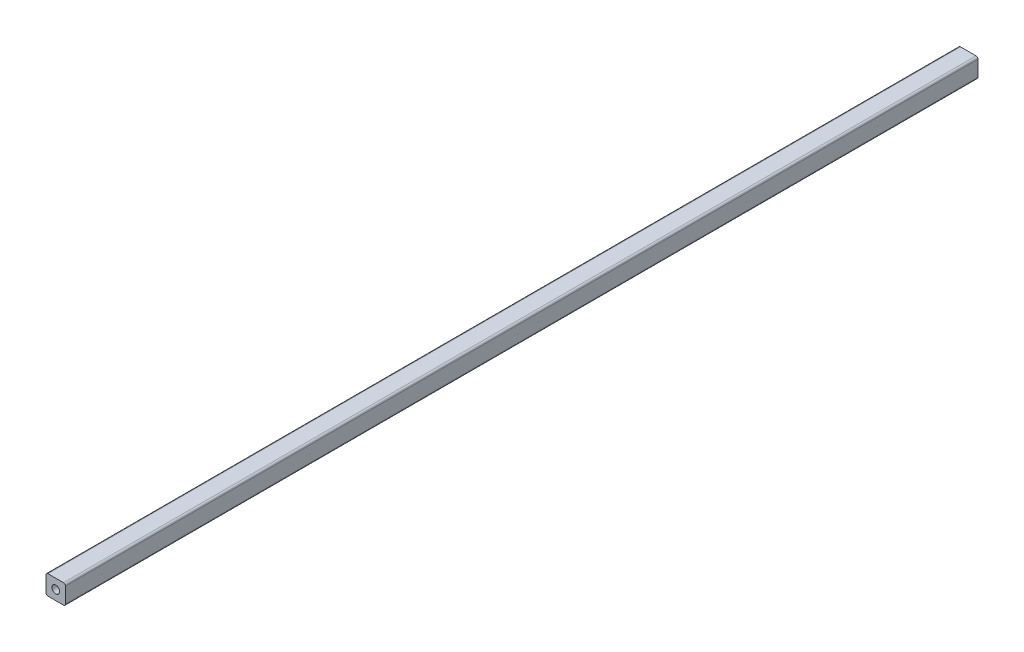
ISO-10303-21;
HEADER;
FILE_DESCRIPTION(('STEP AP214'),'2;1');
FILE_NAME('part.step','',(''),(''),'','','');
FILE_SCHEMA(('AUTOMOTIVE_DESIGN { 1 0 10303 214 1 1 1 1 }'));
ENDSEC;
DATA;
#1=APPLICATION_CONTEXT('core data for automotive mechanical design processes');
#2=APPLICATION_PROTOCOL_DEFINITION('international standard','automotive_design',2000,#1);
#3=PRODUCT_CONTEXT('',#1,'mechanical');
#4=PRODUCT('Part','Part','',(#3));
#5=PRODUCT_RELATED_PRODUCT_CATEGORY('part','',(#4));
#6=PRODUCT_DEFINITION_FORMATION('','',#4);
#7=PRODUCT_DEFINITION_CONTEXT('part definition',#1,'design');
#8=PRODUCT_DEFINITION('design','',#6,#7);
#9=PRODUCT_DEFINITION_SHAPE('','',#8);
#10=(LENGTH_UNIT() NAMED_UNIT(*) SI_UNIT(.MILLI.,.METRE.));
#11=(NAMED_UNIT(*) PLANE_ANGLE_UNIT() SI_UNIT($,.RADIAN.));
#12=(NAMED_UNIT(*) SI_UNIT($,.STERADIAN.) SOLID_ANGLE_UNIT());
#13=UNCERTAINTY_MEASURE_WITH_UNIT(LENGTH_MEASURE(1.E-05),#10,'distance_accuracy_value','');
#14=(GEOMETRIC_REPRESENTATION_CONTEXT(3) GLOBAL_UNCERTAINTY_ASSIGNED_CONTEXT((#13)) GLOBAL_UNIT_ASSIGNED_CONTEXT((#10,
#11,#12)) REPRESENTATION_CONTEXT('',''));
#15=CARTESIAN_POINT('',(0.,0.,0.));
#16=DIRECTION('',(0.,0.,1.));
#17=DIRECTION('',(1.,0.,0.));
#18=AXIS2_PLACEMENT_3D('',#15,#16,#17);
#19=CARTESIAN_POINT('',(0.,0.,2381.25));
#20=DIRECTION('',(0.,0.,1.));
#21=DIRECTION('',(1.,0.,0.));
#22=AXIS2_PLACEMENT_3D('',#19,#20,#21);
#23=PLANE('',#22);
#24=DIRECTION('',(1.,0.,0.));
#25=VECTOR('',#24,1.);
#26=CARTESIAN_POINT('',(-25.4,-25.4,2381.25));
#27=LINE('',#26,#25);
#28=CARTESIAN_POINT('',(-20.4,-25.4,2381.25));
#29=VERTEX_POINT('',#28);
#30=CARTESIAN_POINT('',(20.4,-25.4,2381.25));
#31=VERTEX_POINT('',#30);
#32=EDGE_CURVE('E135',#29,#31,#27,.T.);
#33=ORIENTED_EDGE('',*,*,#32,.T.);
#34=CARTESIAN_POINT('',(20.4,-20.4,2381.25));
#35=DIRECTION('',(0.,0.,1.));
#36=DIRECTION('',(1.,0.,0.));
#37=AXIS2_PLACEMENT_3D('',#34,#35,#36);
#38=CIRCLE('',#37,5.);
#39=CARTESIAN_POINT('',(25.4,-20.4,2381.25));
#40=VERTEX_POINT('',#39);
#41=EDGE_CURVE('E154',#31,#40,#38,.T.);
#42=ORIENTED_EDGE('',*,*,#41,.T.);
#43=DIRECTION('',(0.,1.,0.));
#44=VECTOR('',#43,1.);
#45=CARTESIAN_POINT('',(25.4,25.4,2381.25));
#46=LINE('',#45,#44);
#47=CARTESIAN_POINT('',(25.4,20.4,2381.25));
#48=VERTEX_POINT('',#47);
#49=EDGE_CURVE('E118',#40,#48,#46,.T.);
#50=ORIENTED_EDGE('',*,*,#49,.T.);
#51=CARTESIAN_POINT('',(20.4,20.4,2381.25));
#52=DIRECTION('',(0.,0.,1.));
#53=DIRECTION('',(1.,0.,0.));
#54=AXIS2_PLACEMENT_3D('',#51,#52,#53);
#55=CIRCLE('',#54,5.);
#56=CARTESIAN_POINT('',(20.4,25.4,2381.25));
#57=VERTEX_POINT('',#56);
#58=EDGE_CURVE('E149',#48,#57,#55,.T.);
#59=ORIENTED_EDGE('',*,*,#58,.T.);
#60=DIRECTION('',(-1.,0.,0.));
#61=VECTOR('',#60,1.);
#62=CARTESIAN_POINT('',(-25.4,25.4,2381.25));
#63=LINE('',#62,#61);
#64=CARTESIAN_POINT('',(-20.4,25.4,2381.25));
#65=VERTEX_POINT('',#64);
#66=EDGE_CURVE('E165',#57,#65,#63,.T.);
#67=ORIENTED_EDGE('',*,*,#66,.T.);
#68=CARTESIAN_POINT('',(-20.4,20.4,2381.25));
#69=DIRECTION('',(0.,0.,1.));
#70=DIRECTION('',(1.,0.,0.));
#71=AXIS2_PLACEMENT_3D('',#68,#69,#70);
#72=CIRCLE('',#71,5.);
#73=CARTESIAN_POINT('',(-25.4,20.4,2381.25));
#74=VERTEX_POINT('',#73);
#75=EDGE_CURVE('E54',#65,#74,#72,.T.);
#76=ORIENTED_EDGE('',*,*,#75,.T.);
#77=DIRECTION('',(0.,-1.,0.));
#78=VECTOR('',#77,1.);
#79=CARTESIAN_POINT('',(-25.4,25.4,2381.25));
#80=LINE('',#79,#78);
#81=CARTESIAN_POINT('',(-25.4,-20.4,2381.25));
#82=VERTEX_POINT('',#81);
#83=EDGE_CURVE('E173',#74,#82,#80,.T.);
#84=ORIENTED_EDGE('',*,*,#83,.T.);
#85=CARTESIAN_POINT('',(-20.4,-20.4,2381.25));
#86=DIRECTION('',(0.,0.,1.));
#87=DIRECTION('',(1.,0.,0.));
#88=AXIS2_PLACEMENT_3D('',#85,#86,#87);
#89=CIRCLE('',#88,5.);
#90=EDGE_CURVE('E152',#82,#29,#89,.T.);
#91=ORIENTED_EDGE('',*,*,#90,.T.);
#92=EDGE_LOOP('',(#33,#42,#50,#59,#67,#76,#84,#91));
#93=FACE_BOUND('',#92,.T.);
#94=CARTESIAN_POINT('',(0.,0.,2381.25));
#95=DIRECTION('',(0.,0.,1.));
#96=DIRECTION('',(1.,0.,0.));
#97=AXIS2_PLACEMENT_3D('',#94,#95,#96);
#98=CIRCLE('',#97,10.);
#99=CARTESIAN_POINT('',(9.99999999999999,0.,2381.25));
#100=VERTEX_POINT('',#99);
#101=EDGE_CURVE('E126',#100,#100,#98,.T.);
#102=ORIENTED_EDGE('',*,*,#101,.F.);
#103=EDGE_LOOP('',(#102));
#104=FACE_BOUND('',#103,.T.);
#105=ADVANCED_FACE('F32',(#93,#104),#23,.T.);
#106=CARTESIAN_POINT('',(0.,0.,0.));
#107=DIRECTION('',(0.,0.,1.));
#108=DIRECTION('',(1.,0.,0.));
#109=AXIS2_PLACEMENT_3D('',#106,#107,#108);
#110=PLANE('',#109);
#111=DIRECTION('',(0.,1.,0.));
#112=VECTOR('',#111,1.);
#113=CARTESIAN_POINT('',(25.4,25.4,0.));
#114=LINE('',#113,#112);
#115=CARTESIAN_POINT('',(25.4,-20.4,0.));
#116=VERTEX_POINT('',#115);
#117=CARTESIAN_POINT('',(25.4,20.4,0.));
#118=VERTEX_POINT('',#117);
#119=EDGE_CURVE('E115',#116,#118,#114,.T.);
#120=ORIENTED_EDGE('',*,*,#119,.F.);
#121=CARTESIAN_POINT('',(20.4,-20.4,0.));
#122=DIRECTION('',(0.,0.,1.));
#123=DIRECTION('',(1.,0.,0.));
#124=AXIS2_PLACEMENT_3D('',#121,#122,#123);
#125=CIRCLE('',#124,5.);
#126=CARTESIAN_POINT('',(20.4,-25.4,0.));
#127=VERTEX_POINT('',#126);
#128=EDGE_CURVE('E98',#116,#127,#125,.F.);
#129=ORIENTED_EDGE('',*,*,#128,.T.);
#130=DIRECTION('',(1.,0.,0.));
#131=VECTOR('',#130,1.);
#132=CARTESIAN_POINT('',(-25.4,-25.4,0.));
#133=LINE('',#132,#131);
#134=CARTESIAN_POINT('',(-20.4,-25.4,0.));
#135=VERTEX_POINT('',#134);
#136=EDGE_CURVE('E139',#135,#127,#133,.T.);
#137=ORIENTED_EDGE('',*,*,#136,.F.);
#138=CARTESIAN_POINT('',(-20.4,-20.4,0.));
#139=DIRECTION('',(0.,0.,1.));
#140=DIRECTION('',(1.,0.,0.));
#141=AXIS2_PLACEMENT_3D('',#138,#139,#140);
#142=CIRCLE('',#141,5.);
#143=CARTESIAN_POINT('',(-25.4,-20.4,0.));
#144=VERTEX_POINT('',#143);
#145=EDGE_CURVE('E109',#135,#144,#142,.F.);
#146=ORIENTED_EDGE('',*,*,#145,.T.);
#147=DIRECTION('',(0.,-1.,0.));
#148=VECTOR('',#147,1.);
#149=CARTESIAN_POINT('',(-25.4,25.4,0.));
#150=LINE('',#149,#148);
#151=CARTESIAN_POINT('',(-25.4,20.4,0.));
#152=VERTEX_POINT('',#151);
#153=EDGE_CURVE('E129',#152,#144,#150,.T.);
#154=ORIENTED_EDGE('',*,*,#153,.F.);
#155=CARTESIAN_POINT('',(-20.4,20.4,0.));
#156=DIRECTION('',(0.,0.,1.));
#157=DIRECTION('',(1.,0.,0.));
#158=AXIS2_PLACEMENT_3D('',#155,#156,#157);
#159=CIRCLE('',#158,5.);
#160=CARTESIAN_POINT('',(-20.4,25.4,0.));
#161=VERTEX_POINT('',#160);
#162=EDGE_CURVE('E143',#152,#161,#159,.F.);
#163=ORIENTED_EDGE('',*,*,#162,.T.);
#164=DIRECTION('',(-1.,0.,0.));
#165=VECTOR('',#164,1.);
#166=CARTESIAN_POINT('',(-25.4,25.4,0.));
#167=LINE('',#166,#165);
#168=CARTESIAN_POINT('',(20.4,25.4,0.));
#169=VERTEX_POINT('',#168);
#170=EDGE_CURVE('E125',#169,#161,#167,.T.);
#171=ORIENTED_EDGE('',*,*,#170,.F.);
#172=CARTESIAN_POINT('',(20.4,20.4,0.));
#173=DIRECTION('',(0.,0.,1.));
#174=DIRECTION('',(1.,0.,0.));
#175=AXIS2_PLACEMENT_3D('',#172,#173,#174);
#176=CIRCLE('',#175,5.);
#177=EDGE_CURVE('E119',#169,#118,#176,.F.);
#178=ORIENTED_EDGE('',*,*,#177,.T.);
#179=EDGE_LOOP('',(#120,#129,#137,#146,#154,#163,#171,#178));
#180=FACE_BOUND('',#179,.T.);
#181=CARTESIAN_POINT('',(0.,0.,0.));
#182=DIRECTION('',(0.,0.,1.));
#183=DIRECTION('',(1.,0.,0.));
#184=AXIS2_PLACEMENT_3D('',#181,#182,#183);
#185=CIRCLE('',#184,10.);
#186=CARTESIAN_POINT('',(9.99999999999999,0.,0.));
#187=VERTEX_POINT('',#186);
#188=EDGE_CURVE('E132',#187,#187,#185,.T.);
#189=ORIENTED_EDGE('',*,*,#188,.T.);
#190=EDGE_LOOP('',(#189));
#191=FACE_BOUND('',#190,.T.);
#192=ADVANCED_FACE('F122',(#180,#191),#110,.F.);
#193=CARTESIAN_POINT('',(25.4,25.4,2381.25));
#194=DIRECTION('',(-1.,0.,0.));
#195=DIRECTION('',(0.,-1.,0.));
#196=AXIS2_PLACEMENT_3D('',#193,#194,#195);
#197=PLANE('',#196);
#198=ORIENTED_EDGE('',*,*,#49,.F.);
#199=DIRECTION('',(0.,0.,-1.));
#200=VECTOR('',#199,1.);
#201=CARTESIAN_POINT('',(25.4,-20.4,2381.25));
#202=LINE('',#201,#200);
#203=EDGE_CURVE('E102',#40,#116,#202,.T.);
#204=ORIENTED_EDGE('',*,*,#203,.T.);
#205=ORIENTED_EDGE('',*,*,#119,.T.);
#206=DIRECTION('',(0.,0.,-1.));
#207=VECTOR('',#206,1.);
#208=CARTESIAN_POINT('',(25.4,20.4,2381.25));
#209=LINE('',#208,#207);
#210=EDGE_CURVE('E120',#118,#48,#209,.F.);
#211=ORIENTED_EDGE('',*,*,#210,.T.);
#212=EDGE_LOOP('',(#198,#204,#205,#211));
#213=FACE_BOUND('',#212,.T.);
#214=ADVANCED_FACE('F114',(#213),#197,.F.);
#215=CARTESIAN_POINT('',(-25.4,25.4,2381.25));
#216=DIRECTION('',(0.,-1.,0.));
#217=DIRECTION('',(1.,0.,0.));
#218=AXIS2_PLACEMENT_3D('',#215,#216,#217);
#219=PLANE('',#218);
#220=ORIENTED_EDGE('',*,*,#170,.T.);
#221=DIRECTION('',(0.,0.,-1.));
#222=VECTOR('',#221,1.);
#223=CARTESIAN_POINT('',(-20.4,25.4,2381.25));
#224=LINE('',#223,#222);
#225=EDGE_CURVE('E11',#161,#65,#224,.F.);
#226=ORIENTED_EDGE('',*,*,#225,.T.);
#227=ORIENTED_EDGE('',*,*,#66,.F.);
#228=DIRECTION('',(0.,0.,-1.));
#229=VECTOR('',#228,1.);
#230=CARTESIAN_POINT('',(20.4,25.4,2381.25));
#231=LINE('',#230,#229);
#232=EDGE_CURVE('E40',#57,#169,#231,.T.);
#233=ORIENTED_EDGE('',*,*,#232,.T.);
#234=EDGE_LOOP('',(#220,#226,#227,#233));
#235=FACE_BOUND('',#234,.T.);
#236=ADVANCED_FACE('F163',(#235),#219,.F.);
#237=CARTESIAN_POINT('',(-25.4,25.4,2381.25));
#238=DIRECTION('',(1.,0.,0.));
#239=DIRECTION('',(0.,0.,-1.));
#240=AXIS2_PLACEMENT_3D('',#237,#238,#239);
#241=PLANE('',#240);
#242=ORIENTED_EDGE('',*,*,#153,.T.);
#243=DIRECTION('',(0.,0.,-1.));
#244=VECTOR('',#243,1.);
#245=CARTESIAN_POINT('',(-25.4,-20.4,2381.25));
#246=LINE('',#245,#244);
#247=EDGE_CURVE('E47',#144,#82,#246,.F.);
#248=ORIENTED_EDGE('',*,*,#247,.T.);
#249=ORIENTED_EDGE('',*,*,#83,.F.);
#250=DIRECTION('',(0.,0.,-1.));
#251=VECTOR('',#250,1.);
#252=CARTESIAN_POINT('',(-25.4,20.4,2381.25));
#253=LINE('',#252,#251);
#254=EDGE_CURVE('E156',#74,#152,#253,.T.);
#255=ORIENTED_EDGE('',*,*,#254,.T.);
#256=EDGE_LOOP('',(#242,#248,#249,#255));
#257=FACE_BOUND('',#256,.T.);
#258=ADVANCED_FACE('F172',(#257),#241,.F.);
#259=CARTESIAN_POINT('',(-25.4,-25.4,2381.25));
#260=DIRECTION('',(0.,1.,0.));
#261=DIRECTION('',(0.,0.,1.));
#262=AXIS2_PLACEMENT_3D('',#259,#260,#261);
#263=PLANE('',#262);
#264=ORIENTED_EDGE('',*,*,#136,.T.);
#265=DIRECTION('',(0.,0.,-1.));
#266=VECTOR('',#265,1.);
#267=CARTESIAN_POINT('',(20.4,-25.4,2381.25));
#268=LINE('',#267,#266);
#269=EDGE_CURVE('E103',#127,#31,#268,.F.);
#270=ORIENTED_EDGE('',*,*,#269,.T.);
#271=ORIENTED_EDGE('',*,*,#32,.F.);
#272=DIRECTION('',(0.,0.,-1.));
#273=VECTOR('',#272,1.);
#274=CARTESIAN_POINT('',(-20.4,-25.4,2381.25));
#275=LINE('',#274,#273);
#276=EDGE_CURVE('E108',#29,#135,#275,.T.);
#277=ORIENTED_EDGE('',*,*,#276,.T.);
#278=EDGE_LOOP('',(#264,#270,#271,#277));
#279=FACE_BOUND('',#278,.T.);
#280=ADVANCED_FACE('F184',(#279),#263,.F.);
#281=CARTESIAN_POINT('',(0.,0.,2381.25));
#282=DIRECTION('',(0.,0.,-1.));
#283=DIRECTION('',(-1.,0.,0.));
#284=AXIS2_PLACEMENT_3D('',#281,#282,#283);
#285=CYLINDRICAL_SURFACE('',#284,10.);
#286=ORIENTED_EDGE('',*,*,#101,.T.);
#287=EDGE_LOOP('',(#286));
#288=FACE_BOUND('',#287,.T.);
#289=ORIENTED_EDGE('',*,*,#188,.F.);
#290=EDGE_LOOP('',(#289));
#291=FACE_BOUND('',#290,.T.);
#292=ADVANCED_FACE('F182',(#288,#291),#285,.F.);
#293=CARTESIAN_POINT('',(20.4,-20.4,2381.25));
#294=DIRECTION('',(0.,0.,-1.));
#295=DIRECTION('',(-1.,0.,0.));
#296=AXIS2_PLACEMENT_3D('',#293,#294,#295);
#297=CYLINDRICAL_SURFACE('',#296,5.);
#298=ORIENTED_EDGE('',*,*,#41,.F.);
#299=ORIENTED_EDGE('',*,*,#269,.F.);
#300=ORIENTED_EDGE('',*,*,#128,.F.);
#301=ORIENTED_EDGE('',*,*,#203,.F.);
#302=EDGE_LOOP('',(#298,#299,#300,#301));
#303=FACE_BOUND('',#302,.T.);
#304=ADVANCED_FACE('F101',(#303),#297,.T.);
#305=CARTESIAN_POINT('',(-20.4,-20.4,2381.25));
#306=DIRECTION('',(0.,0.,-1.));
#307=DIRECTION('',(-1.,0.,0.));
#308=AXIS2_PLACEMENT_3D('',#305,#306,#307);
#309=CYLINDRICAL_SURFACE('',#308,5.);
#310=ORIENTED_EDGE('',*,*,#90,.F.);
#311=ORIENTED_EDGE('',*,*,#247,.F.);
#312=ORIENTED_EDGE('',*,*,#145,.F.);
#313=ORIENTED_EDGE('',*,*,#276,.F.);
#314=EDGE_LOOP('',(#310,#311,#312,#313));
#315=FACE_BOUND('',#314,.T.);
#316=ADVANCED_FACE('F191',(#315),#309,.T.);
#317=CARTESIAN_POINT('',(-20.4,20.4,2381.25));
#318=DIRECTION('',(0.,0.,-1.));
#319=DIRECTION('',(-1.,0.,0.));
#320=AXIS2_PLACEMENT_3D('',#317,#318,#319);
#321=CYLINDRICAL_SURFACE('',#320,5.);
#322=ORIENTED_EDGE('',*,*,#75,.F.);
#323=ORIENTED_EDGE('',*,*,#225,.F.);
#324=ORIENTED_EDGE('',*,*,#162,.F.);
#325=ORIENTED_EDGE('',*,*,#254,.F.);
#326=EDGE_LOOP('',(#322,#323,#324,#325));
#327=FACE_BOUND('',#326,.T.);
#328=ADVANCED_FACE('F171',(#327),#321,.T.);
#329=CARTESIAN_POINT('',(20.4,20.4,2381.25));
#330=DIRECTION('',(0.,0.,-1.));
#331=DIRECTION('',(-1.,0.,0.));
#332=AXIS2_PLACEMENT_3D('',#329,#330,#331);
#333=CYLINDRICAL_SURFACE('',#332,5.);
#334=ORIENTED_EDGE('',*,*,#58,.F.);
#335=ORIENTED_EDGE('',*,*,#210,.F.);
#336=ORIENTED_EDGE('',*,*,#177,.F.);
#337=ORIENTED_EDGE('',*,*,#232,.F.);
#338=EDGE_LOOP('',(#334,#335,#336,#337));
#339=FACE_BOUND('',#338,.T.);
#340=ADVANCED_FACE('F34',(#339),#333,.T.);
#341=CLOSED_SHELL('',(#105,#192,#214,#236,#258,#280,#292,#304,#316,#328,#340));
#342=MANIFOLD_SOLID_BREP('B2',#341);
#343=ADVANCED_BREP_SHAPE_REPRESENTATION('',(#18,#342),#14);
#344=SHAPE_DEFINITION_REPRESENTATION(#9,#343);
ENDSEC;
END-ISO-10303-21;
